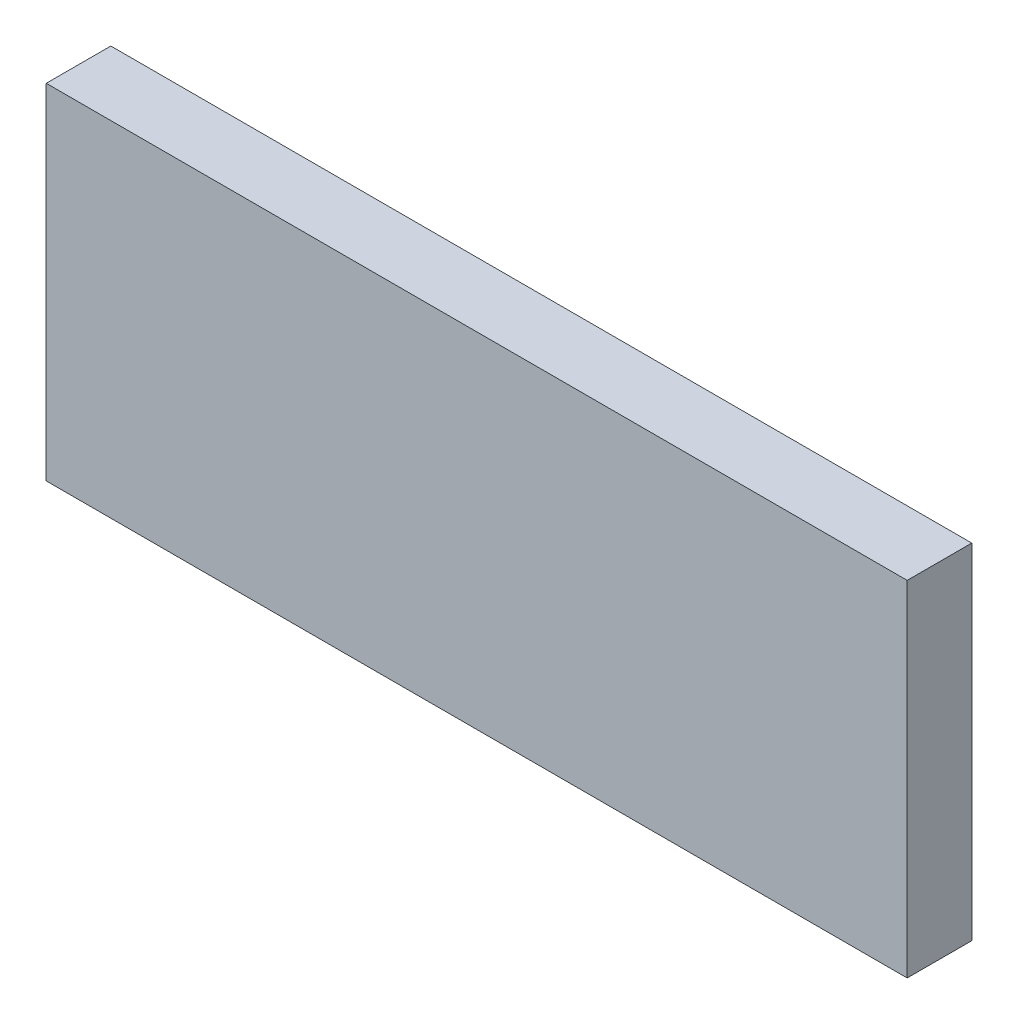
ISO-10303-21;
HEADER;
FILE_DESCRIPTION(('STEP AP214'),'2;1');
FILE_NAME('part.step','',(''),(''),'','','');
FILE_SCHEMA(('AUTOMOTIVE_DESIGN { 1 0 10303 214 1 1 1 1 }'));
ENDSEC;
DATA;
#1=APPLICATION_CONTEXT('core data for automotive mechanical design processes');
#2=APPLICATION_PROTOCOL_DEFINITION('international standard','automotive_design',2000,#1);
#3=PRODUCT_CONTEXT('',#1,'mechanical');
#4=PRODUCT('Part','Part','',(#3));
#5=PRODUCT_RELATED_PRODUCT_CATEGORY('part','',(#4));
#6=PRODUCT_DEFINITION_FORMATION('','',#4);
#7=PRODUCT_DEFINITION_CONTEXT('part definition',#1,'design');
#8=PRODUCT_DEFINITION('design','',#6,#7);
#9=PRODUCT_DEFINITION_SHAPE('','',#8);
#10=(LENGTH_UNIT() NAMED_UNIT(*) SI_UNIT(.MILLI.,.METRE.));
#11=(NAMED_UNIT(*) PLANE_ANGLE_UNIT() SI_UNIT($,.RADIAN.));
#12=(NAMED_UNIT(*) SI_UNIT($,.STERADIAN.) SOLID_ANGLE_UNIT());
#13=UNCERTAINTY_MEASURE_WITH_UNIT(LENGTH_MEASURE(1.E-05),#10,'distance_accuracy_value','');
#14=(GEOMETRIC_REPRESENTATION_CONTEXT(3) GLOBAL_UNCERTAINTY_ASSIGNED_CONTEXT((#13)) GLOBAL_UNIT_ASSIGNED_CONTEXT((#10,
#11,#12)) REPRESENTATION_CONTEXT('',''));
#15=CARTESIAN_POINT('',(0.,0.,0.));
#16=DIRECTION('',(0.,0.,1.));
#17=DIRECTION('',(1.,0.,0.));
#18=AXIS2_PLACEMENT_3D('',#15,#16,#17);
#19=CARTESIAN_POINT('',(-100.,-40.,15.));
#20=DIRECTION('',(1.,0.,0.));
#21=DIRECTION('',(0.,0.,-1.));
#22=AXIS2_PLACEMENT_3D('',#19,#20,#21);
#23=PLANE('',#22);
#24=DIRECTION('',(0.,-1.,0.));
#25=VECTOR('',#24,1.);
#26=CARTESIAN_POINT('',(-100.,-40.,0.));
#27=LINE('',#26,#25);
#28=CARTESIAN_POINT('',(-100.,40.,0.));
#29=VERTEX_POINT('',#28);
#30=CARTESIAN_POINT('',(-100.,-40.,0.));
#31=VERTEX_POINT('',#30);
#32=EDGE_CURVE('E106',#29,#31,#27,.T.);
#33=ORIENTED_EDGE('',*,*,#32,.T.);
#34=DIRECTION('',(0.,0.,-1.));
#35=VECTOR('',#34,1.);
#36=CARTESIAN_POINT('',(-100.,-40.,15.));
#37=LINE('',#36,#35);
#38=CARTESIAN_POINT('',(-100.,-40.,15.));
#39=VERTEX_POINT('',#38);
#40=EDGE_CURVE('E11',#39,#31,#37,.T.);
#41=ORIENTED_EDGE('',*,*,#40,.F.);
#42=DIRECTION('',(0.,-1.,0.));
#43=VECTOR('',#42,1.);
#44=CARTESIAN_POINT('',(-100.,-40.,15.));
#45=LINE('',#44,#43);
#46=CARTESIAN_POINT('',(-100.,40.,15.));
#47=VERTEX_POINT('',#46);
#48=EDGE_CURVE('E94',#47,#39,#45,.T.);
#49=ORIENTED_EDGE('',*,*,#48,.F.);
#50=DIRECTION('',(0.,0.,-1.));
#51=VECTOR('',#50,1.);
#52=CARTESIAN_POINT('',(-100.,40.,15.));
#53=LINE('',#52,#51);
#54=EDGE_CURVE('E102',#47,#29,#53,.T.);
#55=ORIENTED_EDGE('',*,*,#54,.T.);
#56=EDGE_LOOP('',(#33,#41,#49,#55));
#57=FACE_BOUND('',#56,.T.);
#58=ADVANCED_FACE('F43',(#57),#23,.F.);
#59=CARTESIAN_POINT('',(-100.,-40.,15.));
#60=DIRECTION('',(0.,1.,0.));
#61=DIRECTION('',(0.,0.,1.));
#62=AXIS2_PLACEMENT_3D('',#59,#60,#61);
#63=PLANE('',#62);
#64=DIRECTION('',(1.,0.,0.));
#65=VECTOR('',#64,1.);
#66=CARTESIAN_POINT('',(-100.,-40.,0.));
#67=LINE('',#66,#65);
#68=CARTESIAN_POINT('',(100.,-40.,0.));
#69=VERTEX_POINT('',#68);
#70=EDGE_CURVE('E98',#31,#69,#67,.T.);
#71=ORIENTED_EDGE('',*,*,#70,.T.);
#72=DIRECTION('',(0.,0.,-1.));
#73=VECTOR('',#72,1.);
#74=CARTESIAN_POINT('',(100.,-40.,15.));
#75=LINE('',#74,#73);
#76=CARTESIAN_POINT('',(100.,-40.,15.));
#77=VERTEX_POINT('',#76);
#78=EDGE_CURVE('E51',#77,#69,#75,.T.);
#79=ORIENTED_EDGE('',*,*,#78,.F.);
#80=DIRECTION('',(1.,0.,0.));
#81=VECTOR('',#80,1.);
#82=CARTESIAN_POINT('',(-100.,-40.,15.));
#83=LINE('',#82,#81);
#84=EDGE_CURVE('E89',#39,#77,#83,.T.);
#85=ORIENTED_EDGE('',*,*,#84,.F.);
#86=ORIENTED_EDGE('',*,*,#40,.T.);
#87=EDGE_LOOP('',(#71,#79,#85,#86));
#88=FACE_BOUND('',#87,.T.);
#89=ADVANCED_FACE('F97',(#88),#63,.F.);
#90=CARTESIAN_POINT('',(100.,-40.,15.));
#91=DIRECTION('',(-1.,0.,0.));
#92=DIRECTION('',(0.,0.,1.));
#93=AXIS2_PLACEMENT_3D('',#90,#91,#92);
#94=PLANE('',#93);
#95=DIRECTION('',(0.,1.,0.));
#96=VECTOR('',#95,1.);
#97=CARTESIAN_POINT('',(100.,-40.,0.));
#98=LINE('',#97,#96);
#99=CARTESIAN_POINT('',(100.,40.,0.));
#100=VERTEX_POINT('',#99);
#101=EDGE_CURVE('E76',#69,#100,#98,.T.);
#102=ORIENTED_EDGE('',*,*,#101,.T.);
#103=DIRECTION('',(0.,0.,-1.));
#104=VECTOR('',#103,1.);
#105=CARTESIAN_POINT('',(100.,40.,15.));
#106=LINE('',#105,#104);
#107=CARTESIAN_POINT('',(100.,40.,15.));
#108=VERTEX_POINT('',#107);
#109=EDGE_CURVE('E99',#108,#100,#106,.T.);
#110=ORIENTED_EDGE('',*,*,#109,.F.);
#111=DIRECTION('',(0.,1.,0.));
#112=VECTOR('',#111,1.);
#113=CARTESIAN_POINT('',(100.,-40.,15.));
#114=LINE('',#113,#112);
#115=EDGE_CURVE('E92',#77,#108,#114,.T.);
#116=ORIENTED_EDGE('',*,*,#115,.F.);
#117=ORIENTED_EDGE('',*,*,#78,.T.);
#118=EDGE_LOOP('',(#102,#110,#116,#117));
#119=FACE_BOUND('',#118,.T.);
#120=ADVANCED_FACE('F100',(#119),#94,.F.);
#121=CARTESIAN_POINT('',(-100.,40.,15.));
#122=DIRECTION('',(0.,-1.,0.));
#123=DIRECTION('',(0.,0.,-1.));
#124=AXIS2_PLACEMENT_3D('',#121,#122,#123);
#125=PLANE('',#124);
#126=DIRECTION('',(-1.,0.,0.));
#127=VECTOR('',#126,1.);
#128=CARTESIAN_POINT('',(-100.,40.,0.));
#129=LINE('',#128,#127);
#130=EDGE_CURVE('E82',#100,#29,#129,.T.);
#131=ORIENTED_EDGE('',*,*,#130,.T.);
#132=ORIENTED_EDGE('',*,*,#54,.F.);
#133=DIRECTION('',(-1.,0.,0.));
#134=VECTOR('',#133,1.);
#135=CARTESIAN_POINT('',(-100.,40.,15.));
#136=LINE('',#135,#134);
#137=EDGE_CURVE('E59',#108,#47,#136,.T.);
#138=ORIENTED_EDGE('',*,*,#137,.F.);
#139=ORIENTED_EDGE('',*,*,#109,.T.);
#140=EDGE_LOOP('',(#131,#132,#138,#139));
#141=FACE_BOUND('',#140,.T.);
#142=ADVANCED_FACE('F113',(#141),#125,.F.);
#143=CARTESIAN_POINT('',(0.,0.,15.));
#144=DIRECTION('',(0.,0.,-1.));
#145=DIRECTION('',(-1.,0.,0.));
#146=AXIS2_PLACEMENT_3D('',#143,#144,#145);
#147=PLANE('',#146);
#148=ORIENTED_EDGE('',*,*,#48,.T.);
#149=ORIENTED_EDGE('',*,*,#84,.T.);
#150=ORIENTED_EDGE('',*,*,#115,.T.);
#151=ORIENTED_EDGE('',*,*,#137,.T.);
#152=EDGE_LOOP('',(#148,#149,#150,#151));
#153=FACE_BOUND('',#152,.T.);
#154=ADVANCED_FACE('F90',(#153),#147,.F.);
#155=CARTESIAN_POINT('',(0.,0.,0.));
#156=DIRECTION('',(0.,0.,-1.));
#157=DIRECTION('',(-1.,0.,0.));
#158=AXIS2_PLACEMENT_3D('',#155,#156,#157);
#159=PLANE('',#158);
#160=ORIENTED_EDGE('',*,*,#32,.F.);
#161=ORIENTED_EDGE('',*,*,#130,.F.);
#162=ORIENTED_EDGE('',*,*,#101,.F.);
#163=ORIENTED_EDGE('',*,*,#70,.F.);
#164=EDGE_LOOP('',(#160,#161,#162,#163));
#165=FACE_BOUND('',#164,.T.);
#166=ADVANCED_FACE('F116',(#165),#159,.T.);
#167=CLOSED_SHELL('',(#58,#89,#120,#142,#154,#166));
#168=MANIFOLD_SOLID_BREP('B2',#167);
#169=ADVANCED_BREP_SHAPE_REPRESENTATION('',(#18,#168),#14);
#170=SHAPE_DEFINITION_REPRESENTATION(#9,#169);
ENDSEC;
END-ISO-10303-21;
